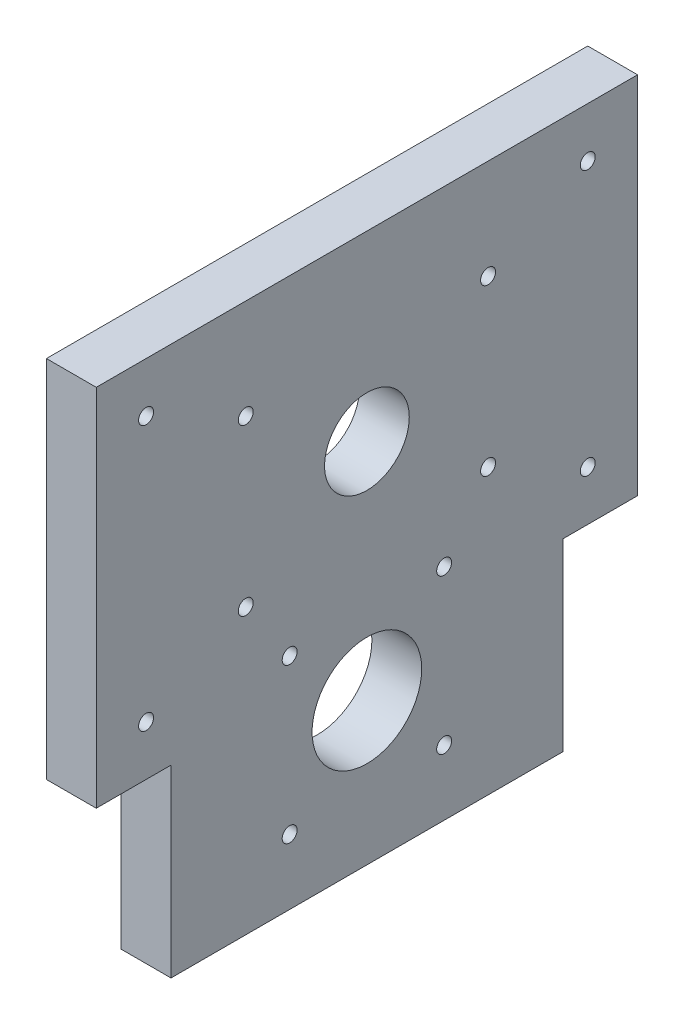
ISO-10303-21;
HEADER;
FILE_DESCRIPTION(('STEP AP214'),'2;1');
FILE_NAME('part.step','',(''),(''),'','','');
FILE_SCHEMA(('AUTOMOTIVE_DESIGN { 1 0 10303 214 1 1 1 1 }'));
ENDSEC;
DATA;
#1=APPLICATION_CONTEXT('core data for automotive mechanical design processes');
#2=APPLICATION_PROTOCOL_DEFINITION('international standard','automotive_design',2000,#1);
#3=PRODUCT_CONTEXT('',#1,'mechanical');
#4=PRODUCT('Part','Part','',(#3));
#5=PRODUCT_RELATED_PRODUCT_CATEGORY('part','',(#4));
#6=PRODUCT_DEFINITION_FORMATION('','',#4);
#7=PRODUCT_DEFINITION_CONTEXT('part definition',#1,'design');
#8=PRODUCT_DEFINITION('design','',#6,#7);
#9=PRODUCT_DEFINITION_SHAPE('','',#8);
#10=(LENGTH_UNIT() NAMED_UNIT(*) SI_UNIT(.MILLI.,.METRE.));
#11=(NAMED_UNIT(*) PLANE_ANGLE_UNIT() SI_UNIT($,.RADIAN.));
#12=(NAMED_UNIT(*) SI_UNIT($,.STERADIAN.) SOLID_ANGLE_UNIT());
#13=UNCERTAINTY_MEASURE_WITH_UNIT(LENGTH_MEASURE(1.E-05),#10,'distance_accuracy_value','');
#14=(GEOMETRIC_REPRESENTATION_CONTEXT(3) GLOBAL_UNCERTAINTY_ASSIGNED_CONTEXT((#13)) GLOBAL_UNIT_ASSIGNED_CONTEXT((#10,
#11,#12)) REPRESENTATION_CONTEXT('',''));
#15=CARTESIAN_POINT('',(0.,0.,0.));
#16=DIRECTION('',(0.,0.,1.));
#17=DIRECTION('',(1.,0.,0.));
#18=AXIS2_PLACEMENT_3D('',#15,#16,#17);
#19=CARTESIAN_POINT('',(10.,0.,0.));
#20=DIRECTION('',(1.,0.,0.));
#21=DIRECTION('',(0.,0.,-1.));
#22=AXIS2_PLACEMENT_3D('',#19,#20,#21);
#23=PLANE('',#22);
#24=CARTESIAN_POINT('',(10.,0.,-6.81500000000017));
#25=DIRECTION('',(1.,0.,0.));
#26=DIRECTION('',(0.,0.,-1.));
#27=AXIS2_PLACEMENT_3D('',#24,#25,#26);
#28=CIRCLE('',#27,8.5);
#29=CARTESIAN_POINT('',(10.,0.,-15.3150000000002));
#30=VERTEX_POINT('',#29);
#31=EDGE_CURVE('E251',#30,#30,#28,.T.);
#32=ORIENTED_EDGE('',*,*,#31,.F.);
#33=EDGE_LOOP('',(#32));
#34=FACE_BOUND('',#33,.T.);
#35=CARTESIAN_POINT('',(10.,-60.5,8.685));
#36=DIRECTION('',(1.,0.,0.));
#37=DIRECTION('',(0.,0.,-1.));
#38=AXIS2_PLACEMENT_3D('',#35,#36,#37);
#39=CIRCLE('',#38,1.5);
#40=CARTESIAN_POINT('',(10.,-60.5,7.18499999999999));
#41=VERTEX_POINT('',#40);
#42=EDGE_CURVE('E239',#41,#41,#39,.T.);
#43=ORIENTED_EDGE('',*,*,#42,.F.);
#44=EDGE_LOOP('',(#43));
#45=FACE_BOUND('',#44,.T.);
#46=CARTESIAN_POINT('',(10.,-29.5,8.685));
#47=DIRECTION('',(1.,0.,0.));
#48=DIRECTION('',(0.,0.,-1.));
#49=AXIS2_PLACEMENT_3D('',#46,#47,#48);
#50=CIRCLE('',#49,1.5);
#51=CARTESIAN_POINT('',(10.,-29.5,7.18499999999999));
#52=VERTEX_POINT('',#51);
#53=EDGE_CURVE('E227',#52,#52,#50,.T.);
#54=ORIENTED_EDGE('',*,*,#53,.F.);
#55=EDGE_LOOP('',(#54));
#56=FACE_BOUND('',#55,.T.);
#57=CARTESIAN_POINT('',(10.,-16.58,-31.1300000000003));
#58=DIRECTION('',(1.,0.,0.));
#59=DIRECTION('',(0.,0.,-1.));
#60=AXIS2_PLACEMENT_3D('',#57,#58,#59);
#61=CIRCLE('',#60,1.5);
#62=CARTESIAN_POINT('',(10.,-16.58,-32.6300000000003));
#63=VERTEX_POINT('',#62);
#64=EDGE_CURVE('E215',#63,#63,#61,.T.);
#65=ORIENTED_EDGE('',*,*,#64,.F.);
#66=EDGE_LOOP('',(#65));
#67=FACE_BOUND('',#66,.T.);
#68=CARTESIAN_POINT('',(10.,-26.58,37.4999999999994));
#69=DIRECTION('',(1.,0.,0.));
#70=DIRECTION('',(0.,0.,-1.));
#71=AXIS2_PLACEMENT_3D('',#68,#69,#70);
#72=CIRCLE('',#71,1.5);
#73=CARTESIAN_POINT('',(10.,-26.58,35.9999999999994));
#74=VERTEX_POINT('',#73);
#75=EDGE_CURVE('E203',#74,#74,#72,.T.);
#76=ORIENTED_EDGE('',*,*,#75,.F.);
#77=EDGE_LOOP('',(#76));
#78=FACE_BOUND('',#77,.T.);
#79=CARTESIAN_POINT('',(10.,16.58,-31.13));
#80=DIRECTION('',(1.,0.,0.));
#81=DIRECTION('',(0.,0.,-1.));
#82=AXIS2_PLACEMENT_3D('',#79,#80,#81);
#83=CIRCLE('',#82,1.5);
#84=CARTESIAN_POINT('',(10.,16.58,-32.63));
#85=VERTEX_POINT('',#84);
#86=EDGE_CURVE('E191',#85,#85,#83,.T.);
#87=ORIENTED_EDGE('',*,*,#86,.F.);
#88=EDGE_LOOP('',(#87));
#89=FACE_BOUND('',#88,.T.);
#90=CARTESIAN_POINT('',(10.,26.58,37.5));
#91=DIRECTION('',(1.,0.,0.));
#92=DIRECTION('',(0.,0.,-1.));
#93=AXIS2_PLACEMENT_3D('',#90,#91,#92);
#94=CIRCLE('',#93,1.5);
#95=CARTESIAN_POINT('',(10.,26.58,36.));
#96=VERTEX_POINT('',#95);
#97=EDGE_CURVE('E134',#96,#96,#94,.T.);
#98=ORIENTED_EDGE('',*,*,#97,.F.);
#99=EDGE_LOOP('',(#98));
#100=FACE_BOUND('',#99,.T.);
#101=DIRECTION('',(0.,0.,1.));
#102=VECTOR('',#101,1.);
#103=CARTESIAN_POINT('',(10.,36.58,-61.13));
#104=LINE('',#103,#102);
#105=CARTESIAN_POINT('',(10.,36.58,-61.13));
#106=VERTEX_POINT('',#105);
#107=CARTESIAN_POINT('',(10.,36.58,47.5));
#108=VERTEX_POINT('',#107);
#109=EDGE_CURVE('E94',#106,#108,#104,.T.);
#110=ORIENTED_EDGE('',*,*,#109,.T.);
#111=DIRECTION('',(0.,-1.,0.));
#112=VECTOR('',#111,1.);
#113=CARTESIAN_POINT('',(10.,36.58,47.5));
#114=LINE('',#113,#112);
#115=CARTESIAN_POINT('',(10.,-36.58,47.5));
#116=VERTEX_POINT('',#115);
#117=EDGE_CURVE('E179',#108,#116,#114,.T.);
#118=ORIENTED_EDGE('',*,*,#117,.T.);
#119=DIRECTION('',(0.,0.,-1.));
#120=VECTOR('',#119,1.);
#121=CARTESIAN_POINT('',(10.,-36.58,47.5));
#122=LINE('',#121,#120);
#123=CARTESIAN_POINT('',(10.,-36.58,32.5));
#124=VERTEX_POINT('',#123);
#125=EDGE_CURVE('E162',#116,#124,#122,.T.);
#126=ORIENTED_EDGE('',*,*,#125,.T.);
#127=DIRECTION('',(0.,-1.,0.));
#128=VECTOR('',#127,1.);
#129=CARTESIAN_POINT('',(10.,-36.58,32.5));
#130=LINE('',#129,#128);
#131=CARTESIAN_POINT('',(10.,-73.58,32.5));
#132=VERTEX_POINT('',#131);
#133=EDGE_CURVE('E175',#124,#132,#130,.T.);
#134=ORIENTED_EDGE('',*,*,#133,.T.);
#135=DIRECTION('',(0.,0.,-1.));
#136=VECTOR('',#135,1.);
#137=CARTESIAN_POINT('',(10.,-73.58,32.5));
#138=LINE('',#137,#136);
#139=CARTESIAN_POINT('',(10.,-73.58,-46.13));
#140=VERTEX_POINT('',#139);
#141=EDGE_CURVE('E114',#132,#140,#138,.T.);
#142=ORIENTED_EDGE('',*,*,#141,.T.);
#143=DIRECTION('',(0.,1.,0.));
#144=VECTOR('',#143,1.);
#145=CARTESIAN_POINT('',(10.,-73.58,-46.13));
#146=LINE('',#145,#144);
#147=CARTESIAN_POINT('',(10.,-36.58,-46.13));
#148=VERTEX_POINT('',#147);
#149=EDGE_CURVE('E108',#140,#148,#146,.T.);
#150=ORIENTED_EDGE('',*,*,#149,.T.);
#151=DIRECTION('',(0.,0.,-1.));
#152=VECTOR('',#151,1.);
#153=CARTESIAN_POINT('',(10.,-36.58,-46.13));
#154=LINE('',#153,#152);
#155=CARTESIAN_POINT('',(10.,-36.58,-61.13));
#156=VERTEX_POINT('',#155);
#157=EDGE_CURVE('E112',#148,#156,#154,.T.);
#158=ORIENTED_EDGE('',*,*,#157,.T.);
#159=DIRECTION('',(0.,1.,0.));
#160=VECTOR('',#159,1.);
#161=CARTESIAN_POINT('',(10.,-36.58,-61.13));
#162=LINE('',#161,#160);
#163=EDGE_CURVE('E52',#156,#106,#162,.T.);
#164=ORIENTED_EDGE('',*,*,#163,.T.);
#165=EDGE_LOOP('',(#110,#118,#126,#134,#142,#150,#158,#164));
#166=FACE_BOUND('',#165,.T.);
#167=CARTESIAN_POINT('',(10.,16.58,17.5));
#168=DIRECTION('',(1.,0.,0.));
#169=DIRECTION('',(0.,0.,-1.));
#170=AXIS2_PLACEMENT_3D('',#167,#168,#169);
#171=CIRCLE('',#170,1.5);
#172=CARTESIAN_POINT('',(10.,16.58,16.));
#173=VERTEX_POINT('',#172);
#174=EDGE_CURVE('E185',#173,#173,#171,.T.);
#175=ORIENTED_EDGE('',*,*,#174,.F.);
#176=EDGE_LOOP('',(#175));
#177=FACE_BOUND('',#176,.T.);
#178=CARTESIAN_POINT('',(10.,26.58,-51.13));
#179=DIRECTION('',(1.,0.,0.));
#180=DIRECTION('',(0.,0.,-1.));
#181=AXIS2_PLACEMENT_3D('',#178,#179,#180);
#182=CIRCLE('',#181,1.5);
#183=CARTESIAN_POINT('',(10.,26.58,-52.63));
#184=VERTEX_POINT('',#183);
#185=EDGE_CURVE('E197',#184,#184,#182,.T.);
#186=ORIENTED_EDGE('',*,*,#185,.F.);
#187=EDGE_LOOP('',(#186));
#188=FACE_BOUND('',#187,.T.);
#189=CARTESIAN_POINT('',(10.,-16.58,17.4999999999997));
#190=DIRECTION('',(1.,0.,0.));
#191=DIRECTION('',(0.,0.,-1.));
#192=AXIS2_PLACEMENT_3D('',#189,#190,#191);
#193=CIRCLE('',#192,1.5);
#194=CARTESIAN_POINT('',(10.,-16.58,15.9999999999997));
#195=VERTEX_POINT('',#194);
#196=EDGE_CURVE('E209',#195,#195,#193,.T.);
#197=ORIENTED_EDGE('',*,*,#196,.F.);
#198=EDGE_LOOP('',(#197));
#199=FACE_BOUND('',#198,.T.);
#200=CARTESIAN_POINT('',(10.,-26.58,-51.1300000000006));
#201=DIRECTION('',(1.,0.,0.));
#202=DIRECTION('',(0.,0.,-1.));
#203=AXIS2_PLACEMENT_3D('',#200,#201,#202);
#204=CIRCLE('',#203,1.5);
#205=CARTESIAN_POINT('',(10.,-26.58,-52.6300000000005));
#206=VERTEX_POINT('',#205);
#207=EDGE_CURVE('E221',#206,#206,#204,.T.);
#208=ORIENTED_EDGE('',*,*,#207,.F.);
#209=EDGE_LOOP('',(#208));
#210=FACE_BOUND('',#209,.T.);
#211=CARTESIAN_POINT('',(10.,-29.5,-22.315));
#212=DIRECTION('',(1.,0.,0.));
#213=DIRECTION('',(0.,0.,-1.));
#214=AXIS2_PLACEMENT_3D('',#211,#212,#213);
#215=CIRCLE('',#214,1.5);
#216=CARTESIAN_POINT('',(10.,-29.5,-23.815));
#217=VERTEX_POINT('',#216);
#218=EDGE_CURVE('E233',#217,#217,#215,.T.);
#219=ORIENTED_EDGE('',*,*,#218,.F.);
#220=EDGE_LOOP('',(#219));
#221=FACE_BOUND('',#220,.T.);
#222=CARTESIAN_POINT('',(10.,-60.5,-22.315));
#223=DIRECTION('',(1.,0.,0.));
#224=DIRECTION('',(0.,0.,-1.));
#225=AXIS2_PLACEMENT_3D('',#222,#223,#224);
#226=CIRCLE('',#225,1.5);
#227=CARTESIAN_POINT('',(10.,-60.5,-23.815));
#228=VERTEX_POINT('',#227);
#229=EDGE_CURVE('E245',#228,#228,#226,.T.);
#230=ORIENTED_EDGE('',*,*,#229,.F.);
#231=EDGE_LOOP('',(#230));
#232=FACE_BOUND('',#231,.T.);
#233=CARTESIAN_POINT('',(10.,-45.,-6.81500000000001));
#234=DIRECTION('',(1.,0.,0.));
#235=DIRECTION('',(0.,0.,-1.));
#236=AXIS2_PLACEMENT_3D('',#233,#234,#235);
#237=CIRCLE('',#236,11.);
#238=CARTESIAN_POINT('',(10.,-45.,-17.815));
#239=VERTEX_POINT('',#238);
#240=EDGE_CURVE('E257',#239,#239,#237,.T.);
#241=ORIENTED_EDGE('',*,*,#240,.F.);
#242=EDGE_LOOP('',(#241));
#243=FACE_BOUND('',#242,.T.);
#244=ADVANCED_FACE('F35',(#34,#45,#56,#67,#78,#89,#100,#166,#177,#188,#199,#210,#221,#232,#243),
#23,.T.);
#245=CARTESIAN_POINT('',(0.,0.,0.));
#246=DIRECTION('',(1.,0.,0.));
#247=DIRECTION('',(0.,0.,-1.));
#248=AXIS2_PLACEMENT_3D('',#245,#246,#247);
#249=PLANE('',#248);
#250=DIRECTION('',(0.,0.,1.));
#251=VECTOR('',#250,1.);
#252=CARTESIAN_POINT('',(0.,36.58,27.5));
#253=LINE('',#252,#251);
#254=CARTESIAN_POINT('',(0.,36.58,-61.13));
#255=VERTEX_POINT('',#254);
#256=CARTESIAN_POINT('',(0.,36.58,47.5));
#257=VERTEX_POINT('',#256);
#258=EDGE_CURVE('E88',#255,#257,#253,.T.);
#259=ORIENTED_EDGE('',*,*,#258,.F.);
#260=DIRECTION('',(0.,1.,0.));
#261=VECTOR('',#260,1.);
#262=CARTESIAN_POINT('',(0.,-36.58,-61.13));
#263=LINE('',#262,#261);
#264=CARTESIAN_POINT('',(0.,-36.58,-61.13));
#265=VERTEX_POINT('',#264);
#266=EDGE_CURVE('E144',#265,#255,#263,.T.);
#267=ORIENTED_EDGE('',*,*,#266,.F.);
#268=DIRECTION('',(0.,0.,-1.));
#269=VECTOR('',#268,1.);
#270=CARTESIAN_POINT('',(0.,-36.58,-46.13));
#271=LINE('',#270,#269);
#272=CARTESIAN_POINT('',(0.,-36.58,-46.13));
#273=VERTEX_POINT('',#272);
#274=EDGE_CURVE('E81',#273,#265,#271,.T.);
#275=ORIENTED_EDGE('',*,*,#274,.F.);
#276=DIRECTION('',(0.,1.,0.));
#277=VECTOR('',#276,1.);
#278=CARTESIAN_POINT('',(0.,-73.58,-46.13));
#279=LINE('',#278,#277);
#280=CARTESIAN_POINT('',(0.,-73.58,-46.13));
#281=VERTEX_POINT('',#280);
#282=EDGE_CURVE('E122',#281,#273,#279,.T.);
#283=ORIENTED_EDGE('',*,*,#282,.F.);
#284=DIRECTION('',(0.,0.,-1.));
#285=VECTOR('',#284,1.);
#286=CARTESIAN_POINT('',(0.,-73.58,32.5));
#287=LINE('',#286,#285);
#288=CARTESIAN_POINT('',(0.,-73.58,32.5));
#289=VERTEX_POINT('',#288);
#290=EDGE_CURVE('E140',#289,#281,#287,.T.);
#291=ORIENTED_EDGE('',*,*,#290,.F.);
#292=DIRECTION('',(0.,-1.,0.));
#293=VECTOR('',#292,1.);
#294=CARTESIAN_POINT('',(0.,-36.58,32.5));
#295=LINE('',#294,#293);
#296=CARTESIAN_POINT('',(0.,-36.58,32.5));
#297=VERTEX_POINT('',#296);
#298=EDGE_CURVE('E138',#297,#289,#295,.T.);
#299=ORIENTED_EDGE('',*,*,#298,.F.);
#300=DIRECTION('',(0.,0.,-1.));
#301=VECTOR('',#300,1.);
#302=CARTESIAN_POINT('',(0.,-36.58,47.5));
#303=LINE('',#302,#301);
#304=CARTESIAN_POINT('',(0.,-36.58,47.5));
#305=VERTEX_POINT('',#304);
#306=EDGE_CURVE('E136',#305,#297,#303,.T.);
#307=ORIENTED_EDGE('',*,*,#306,.F.);
#308=DIRECTION('',(0.,-1.,0.));
#309=VECTOR('',#308,1.);
#310=CARTESIAN_POINT('',(0.,36.58,47.5));
#311=LINE('',#310,#309);
#312=EDGE_CURVE('E133',#257,#305,#311,.T.);
#313=ORIENTED_EDGE('',*,*,#312,.F.);
#314=EDGE_LOOP('',(#259,#267,#275,#283,#291,#299,#307,#313));
#315=FACE_BOUND('',#314,.T.);
#316=CARTESIAN_POINT('',(0.,26.58,37.5));
#317=DIRECTION('',(1.,0.,0.));
#318=DIRECTION('',(0.,0.,-1.));
#319=AXIS2_PLACEMENT_3D('',#316,#317,#318);
#320=CIRCLE('',#319,1.5);
#321=CARTESIAN_POINT('',(0.,26.58,36.));
#322=VERTEX_POINT('',#321);
#323=EDGE_CURVE('E182',#322,#322,#320,.T.);
#324=ORIENTED_EDGE('',*,*,#323,.T.);
#325=EDGE_LOOP('',(#324));
#326=FACE_BOUND('',#325,.T.);
#327=CARTESIAN_POINT('',(0.,16.58,17.5));
#328=DIRECTION('',(1.,0.,0.));
#329=DIRECTION('',(0.,0.,-1.));
#330=AXIS2_PLACEMENT_3D('',#327,#328,#329);
#331=CIRCLE('',#330,1.5);
#332=CARTESIAN_POINT('',(0.,16.58,16.));
#333=VERTEX_POINT('',#332);
#334=EDGE_CURVE('E188',#333,#333,#331,.T.);
#335=ORIENTED_EDGE('',*,*,#334,.T.);
#336=EDGE_LOOP('',(#335));
#337=FACE_BOUND('',#336,.T.);
#338=CARTESIAN_POINT('',(0.,16.58,-31.13));
#339=DIRECTION('',(1.,0.,0.));
#340=DIRECTION('',(0.,0.,-1.));
#341=AXIS2_PLACEMENT_3D('',#338,#339,#340);
#342=CIRCLE('',#341,1.5);
#343=CARTESIAN_POINT('',(0.,16.58,-32.63));
#344=VERTEX_POINT('',#343);
#345=EDGE_CURVE('E194',#344,#344,#342,.T.);
#346=ORIENTED_EDGE('',*,*,#345,.T.);
#347=EDGE_LOOP('',(#346));
#348=FACE_BOUND('',#347,.T.);
#349=CARTESIAN_POINT('',(0.,26.58,-51.13));
#350=DIRECTION('',(1.,0.,0.));
#351=DIRECTION('',(0.,0.,-1.));
#352=AXIS2_PLACEMENT_3D('',#349,#350,#351);
#353=CIRCLE('',#352,1.5);
#354=CARTESIAN_POINT('',(0.,26.58,-52.63));
#355=VERTEX_POINT('',#354);
#356=EDGE_CURVE('E200',#355,#355,#353,.T.);
#357=ORIENTED_EDGE('',*,*,#356,.T.);
#358=EDGE_LOOP('',(#357));
#359=FACE_BOUND('',#358,.T.);
#360=CARTESIAN_POINT('',(0.,-26.58,37.4999999999994));
#361=DIRECTION('',(1.,0.,0.));
#362=DIRECTION('',(0.,0.,-1.));
#363=AXIS2_PLACEMENT_3D('',#360,#361,#362);
#364=CIRCLE('',#363,1.5);
#365=CARTESIAN_POINT('',(0.,-26.58,35.9999999999994));
#366=VERTEX_POINT('',#365);
#367=EDGE_CURVE('E206',#366,#366,#364,.T.);
#368=ORIENTED_EDGE('',*,*,#367,.T.);
#369=EDGE_LOOP('',(#368));
#370=FACE_BOUND('',#369,.T.);
#371=CARTESIAN_POINT('',(0.,-16.58,17.4999999999997));
#372=DIRECTION('',(1.,0.,0.));
#373=DIRECTION('',(0.,0.,-1.));
#374=AXIS2_PLACEMENT_3D('',#371,#372,#373);
#375=CIRCLE('',#374,1.5);
#376=CARTESIAN_POINT('',(0.,-16.58,15.9999999999997));
#377=VERTEX_POINT('',#376);
#378=EDGE_CURVE('E212',#377,#377,#375,.T.);
#379=ORIENTED_EDGE('',*,*,#378,.T.);
#380=EDGE_LOOP('',(#379));
#381=FACE_BOUND('',#380,.T.);
#382=CARTESIAN_POINT('',(0.,-16.58,-31.1300000000003));
#383=DIRECTION('',(1.,0.,0.));
#384=DIRECTION('',(0.,0.,-1.));
#385=AXIS2_PLACEMENT_3D('',#382,#383,#384);
#386=CIRCLE('',#385,1.5);
#387=CARTESIAN_POINT('',(0.,-16.58,-32.6300000000003));
#388=VERTEX_POINT('',#387);
#389=EDGE_CURVE('E218',#388,#388,#386,.T.);
#390=ORIENTED_EDGE('',*,*,#389,.T.);
#391=EDGE_LOOP('',(#390));
#392=FACE_BOUND('',#391,.T.);
#393=CARTESIAN_POINT('',(0.,-26.58,-51.1300000000006));
#394=DIRECTION('',(1.,0.,0.));
#395=DIRECTION('',(0.,0.,-1.));
#396=AXIS2_PLACEMENT_3D('',#393,#394,#395);
#397=CIRCLE('',#396,1.5);
#398=CARTESIAN_POINT('',(0.,-26.58,-52.6300000000005));
#399=VERTEX_POINT('',#398);
#400=EDGE_CURVE('E224',#399,#399,#397,.T.);
#401=ORIENTED_EDGE('',*,*,#400,.T.);
#402=EDGE_LOOP('',(#401));
#403=FACE_BOUND('',#402,.T.);
#404=CARTESIAN_POINT('',(0.,-29.5,8.685));
#405=DIRECTION('',(1.,0.,0.));
#406=DIRECTION('',(0.,0.,-1.));
#407=AXIS2_PLACEMENT_3D('',#404,#405,#406);
#408=CIRCLE('',#407,1.5);
#409=CARTESIAN_POINT('',(0.,-29.5,7.18499999999999));
#410=VERTEX_POINT('',#409);
#411=EDGE_CURVE('E230',#410,#410,#408,.T.);
#412=ORIENTED_EDGE('',*,*,#411,.T.);
#413=EDGE_LOOP('',(#412));
#414=FACE_BOUND('',#413,.T.);
#415=CARTESIAN_POINT('',(0.,-29.5,-22.315));
#416=DIRECTION('',(1.,0.,0.));
#417=DIRECTION('',(0.,0.,-1.));
#418=AXIS2_PLACEMENT_3D('',#415,#416,#417);
#419=CIRCLE('',#418,1.5);
#420=CARTESIAN_POINT('',(0.,-29.5,-23.815));
#421=VERTEX_POINT('',#420);
#422=EDGE_CURVE('E236',#421,#421,#419,.T.);
#423=ORIENTED_EDGE('',*,*,#422,.T.);
#424=EDGE_LOOP('',(#423));
#425=FACE_BOUND('',#424,.T.);
#426=CARTESIAN_POINT('',(0.,-60.5,8.685));
#427=DIRECTION('',(1.,0.,0.));
#428=DIRECTION('',(0.,0.,-1.));
#429=AXIS2_PLACEMENT_3D('',#426,#427,#428);
#430=CIRCLE('',#429,1.5);
#431=CARTESIAN_POINT('',(0.,-60.5,7.18499999999999));
#432=VERTEX_POINT('',#431);
#433=EDGE_CURVE('E242',#432,#432,#430,.T.);
#434=ORIENTED_EDGE('',*,*,#433,.T.);
#435=EDGE_LOOP('',(#434));
#436=FACE_BOUND('',#435,.T.);
#437=CARTESIAN_POINT('',(0.,-60.5,-22.315));
#438=DIRECTION('',(1.,0.,0.));
#439=DIRECTION('',(0.,0.,-1.));
#440=AXIS2_PLACEMENT_3D('',#437,#438,#439);
#441=CIRCLE('',#440,1.5);
#442=CARTESIAN_POINT('',(0.,-60.5,-23.815));
#443=VERTEX_POINT('',#442);
#444=EDGE_CURVE('E248',#443,#443,#441,.T.);
#445=ORIENTED_EDGE('',*,*,#444,.T.);
#446=EDGE_LOOP('',(#445));
#447=FACE_BOUND('',#446,.T.);
#448=CARTESIAN_POINT('',(0.,0.,-6.81500000000017));
#449=DIRECTION('',(1.,0.,0.));
#450=DIRECTION('',(0.,0.,-1.));
#451=AXIS2_PLACEMENT_3D('',#448,#449,#450);
#452=CIRCLE('',#451,8.5);
#453=CARTESIAN_POINT('',(0.,0.,-15.3150000000002));
#454=VERTEX_POINT('',#453);
#455=EDGE_CURVE('E254',#454,#454,#452,.T.);
#456=ORIENTED_EDGE('',*,*,#455,.T.);
#457=EDGE_LOOP('',(#456));
#458=FACE_BOUND('',#457,.T.);
#459=CARTESIAN_POINT('',(0.,-45.,-6.81500000000001));
#460=DIRECTION('',(1.,0.,0.));
#461=DIRECTION('',(0.,0.,-1.));
#462=AXIS2_PLACEMENT_3D('',#459,#460,#461);
#463=CIRCLE('',#462,11.);
#464=CARTESIAN_POINT('',(0.,-45.,-17.815));
#465=VERTEX_POINT('',#464);
#466=EDGE_CURVE('E260',#465,#465,#463,.T.);
#467=ORIENTED_EDGE('',*,*,#466,.T.);
#468=EDGE_LOOP('',(#467));
#469=FACE_BOUND('',#468,.T.);
#470=ADVANCED_FACE('F166',(#315,#326,#337,#348,#359,#370,#381,#392,#403,#414,#425,#436,#447,
#458,#469),#249,.F.);
#471=CARTESIAN_POINT('',(10.,36.58,27.5));
#472=DIRECTION('',(0.,-1.,0.));
#473=DIRECTION('',(0.,0.,-1.));
#474=AXIS2_PLACEMENT_3D('',#471,#472,#473);
#475=PLANE('',#474);
#476=ORIENTED_EDGE('',*,*,#258,.T.);
#477=DIRECTION('',(-1.,0.,0.));
#478=VECTOR('',#477,1.);
#479=CARTESIAN_POINT('',(10.,36.58,47.5));
#480=LINE('',#479,#478);
#481=EDGE_CURVE('E11',#108,#257,#480,.T.);
#482=ORIENTED_EDGE('',*,*,#481,.F.);
#483=ORIENTED_EDGE('',*,*,#109,.F.);
#484=DIRECTION('',(-1.,0.,0.));
#485=VECTOR('',#484,1.);
#486=CARTESIAN_POINT('',(10.,36.58,-61.13));
#487=LINE('',#486,#485);
#488=EDGE_CURVE('E128',#106,#255,#487,.T.);
#489=ORIENTED_EDGE('',*,*,#488,.T.);
#490=EDGE_LOOP('',(#476,#482,#483,#489));
#491=FACE_BOUND('',#490,.T.);
#492=ADVANCED_FACE('F37',(#491),#475,.F.);
#493=CARTESIAN_POINT('',(10.,36.58,47.5));
#494=DIRECTION('',(0.,0.,-1.));
#495=DIRECTION('',(0.,1.,0.));
#496=AXIS2_PLACEMENT_3D('',#493,#494,#495);
#497=PLANE('',#496);
#498=ORIENTED_EDGE('',*,*,#312,.T.);
#499=DIRECTION('',(-1.,0.,0.));
#500=VECTOR('',#499,1.);
#501=CARTESIAN_POINT('',(10.,-36.58,47.5));
#502=LINE('',#501,#500);
#503=EDGE_CURVE('E44',#116,#305,#502,.T.);
#504=ORIENTED_EDGE('',*,*,#503,.F.);
#505=ORIENTED_EDGE('',*,*,#117,.F.);
#506=ORIENTED_EDGE('',*,*,#481,.T.);
#507=EDGE_LOOP('',(#498,#504,#505,#506));
#508=FACE_BOUND('',#507,.T.);
#509=ADVANCED_FACE('F295',(#508),#497,.F.);
#510=CARTESIAN_POINT('',(10.,-36.58,47.5));
#511=DIRECTION('',(0.,1.,0.));
#512=DIRECTION('',(0.,0.,1.));
#513=AXIS2_PLACEMENT_3D('',#510,#511,#512);
#514=PLANE('',#513);
#515=ORIENTED_EDGE('',*,*,#306,.T.);
#516=DIRECTION('',(-1.,0.,0.));
#517=VECTOR('',#516,1.);
#518=CARTESIAN_POINT('',(10.,-36.58,32.5));
#519=LINE('',#518,#517);
#520=EDGE_CURVE('E153',#124,#297,#519,.T.);
#521=ORIENTED_EDGE('',*,*,#520,.F.);
#522=ORIENTED_EDGE('',*,*,#125,.F.);
#523=ORIENTED_EDGE('',*,*,#503,.T.);
#524=EDGE_LOOP('',(#515,#521,#522,#523));
#525=FACE_BOUND('',#524,.T.);
#526=ADVANCED_FACE('F160',(#525),#514,.F.);
#527=CARTESIAN_POINT('',(10.,-36.58,32.5));
#528=DIRECTION('',(0.,0.,-1.));
#529=DIRECTION('',(0.,1.,0.));
#530=AXIS2_PLACEMENT_3D('',#527,#528,#529);
#531=PLANE('',#530);
#532=ORIENTED_EDGE('',*,*,#298,.T.);
#533=DIRECTION('',(-1.,0.,0.));
#534=VECTOR('',#533,1.);
#535=CARTESIAN_POINT('',(10.,-73.58,32.5));
#536=LINE('',#535,#534);
#537=EDGE_CURVE('E150',#132,#289,#536,.T.);
#538=ORIENTED_EDGE('',*,*,#537,.F.);
#539=ORIENTED_EDGE('',*,*,#133,.F.);
#540=ORIENTED_EDGE('',*,*,#520,.T.);
#541=EDGE_LOOP('',(#532,#538,#539,#540));
#542=FACE_BOUND('',#541,.T.);
#543=ADVANCED_FACE('F171',(#542),#531,.F.);
#544=CARTESIAN_POINT('',(10.,-73.58,32.5));
#545=DIRECTION('',(0.,1.,0.));
#546=DIRECTION('',(0.,0.,1.));
#547=AXIS2_PLACEMENT_3D('',#544,#545,#546);
#548=PLANE('',#547);
#549=ORIENTED_EDGE('',*,*,#290,.T.);
#550=DIRECTION('',(-1.,0.,0.));
#551=VECTOR('',#550,1.);
#552=CARTESIAN_POINT('',(10.,-73.58,-46.13));
#553=LINE('',#552,#551);
#554=EDGE_CURVE('E123',#140,#281,#553,.T.);
#555=ORIENTED_EDGE('',*,*,#554,.F.);
#556=ORIENTED_EDGE('',*,*,#141,.F.);
#557=ORIENTED_EDGE('',*,*,#537,.T.);
#558=EDGE_LOOP('',(#549,#555,#556,#557));
#559=FACE_BOUND('',#558,.T.);
#560=ADVANCED_FACE('F174',(#559),#548,.F.);
#561=CARTESIAN_POINT('',(10.,-73.58,-46.13));
#562=DIRECTION('',(0.,0.,1.));
#563=DIRECTION('',(0.,-1.,0.));
#564=AXIS2_PLACEMENT_3D('',#561,#562,#563);
#565=PLANE('',#564);
#566=ORIENTED_EDGE('',*,*,#282,.T.);
#567=DIRECTION('',(-1.,0.,0.));
#568=VECTOR('',#567,1.);
#569=CARTESIAN_POINT('',(10.,-36.58,-46.13));
#570=LINE('',#569,#568);
#571=EDGE_CURVE('E119',#148,#273,#570,.T.);
#572=ORIENTED_EDGE('',*,*,#571,.F.);
#573=ORIENTED_EDGE('',*,*,#149,.F.);
#574=ORIENTED_EDGE('',*,*,#554,.T.);
#575=EDGE_LOOP('',(#566,#572,#573,#574));
#576=FACE_BOUND('',#575,.T.);
#577=ADVANCED_FACE('F120',(#576),#565,.F.);
#578=CARTESIAN_POINT('',(10.,-36.58,-46.13));
#579=DIRECTION('',(0.,1.,0.));
#580=DIRECTION('',(0.,0.,1.));
#581=AXIS2_PLACEMENT_3D('',#578,#579,#580);
#582=PLANE('',#581);
#583=ORIENTED_EDGE('',*,*,#274,.T.);
#584=DIRECTION('',(-1.,0.,0.));
#585=VECTOR('',#584,1.);
#586=CARTESIAN_POINT('',(10.,-36.58,-61.13));
#587=LINE('',#586,#585);
#588=EDGE_CURVE('E124',#156,#265,#587,.T.);
#589=ORIENTED_EDGE('',*,*,#588,.F.);
#590=ORIENTED_EDGE('',*,*,#157,.F.);
#591=ORIENTED_EDGE('',*,*,#571,.T.);
#592=EDGE_LOOP('',(#583,#589,#590,#591));
#593=FACE_BOUND('',#592,.T.);
#594=ADVANCED_FACE('F126',(#593),#582,.F.);
#595=CARTESIAN_POINT('',(10.,-36.58,-61.13));
#596=DIRECTION('',(0.,0.,1.));
#597=DIRECTION('',(1.,0.,0.));
#598=AXIS2_PLACEMENT_3D('',#595,#596,#597);
#599=PLANE('',#598);
#600=ORIENTED_EDGE('',*,*,#266,.T.);
#601=ORIENTED_EDGE('',*,*,#488,.F.);
#602=ORIENTED_EDGE('',*,*,#163,.F.);
#603=ORIENTED_EDGE('',*,*,#588,.T.);
#604=EDGE_LOOP('',(#600,#601,#602,#603));
#605=FACE_BOUND('',#604,.T.);
#606=ADVANCED_FACE('F282',(#605),#599,.F.);
#607=CARTESIAN_POINT('',(10.,26.58,37.5));
#608=DIRECTION('',(-1.,0.,0.));
#609=DIRECTION('',(0.,0.,1.));
#610=AXIS2_PLACEMENT_3D('',#607,#608,#609);
#611=CYLINDRICAL_SURFACE('',#610,1.5);
#612=ORIENTED_EDGE('',*,*,#97,.T.);
#613=EDGE_LOOP('',(#612));
#614=FACE_BOUND('',#613,.T.);
#615=ORIENTED_EDGE('',*,*,#323,.F.);
#616=EDGE_LOOP('',(#615));
#617=FACE_BOUND('',#616,.T.);
#618=ADVANCED_FACE('F279',(#614,#617),#611,.F.);
#619=CARTESIAN_POINT('',(10.,16.58,17.5));
#620=DIRECTION('',(-1.,0.,0.));
#621=DIRECTION('',(0.,0.,1.));
#622=AXIS2_PLACEMENT_3D('',#619,#620,#621);
#623=CYLINDRICAL_SURFACE('',#622,1.5);
#624=ORIENTED_EDGE('',*,*,#174,.T.);
#625=EDGE_LOOP('',(#624));
#626=FACE_BOUND('',#625,.T.);
#627=ORIENTED_EDGE('',*,*,#334,.F.);
#628=EDGE_LOOP('',(#627));
#629=FACE_BOUND('',#628,.T.);
#630=ADVANCED_FACE('F360',(#626,#629),#623,.F.);
#631=CARTESIAN_POINT('',(10.,16.58,-31.13));
#632=DIRECTION('',(-1.,0.,0.));
#633=DIRECTION('',(0.,0.,1.));
#634=AXIS2_PLACEMENT_3D('',#631,#632,#633);
#635=CYLINDRICAL_SURFACE('',#634,1.5);
#636=ORIENTED_EDGE('',*,*,#86,.T.);
#637=EDGE_LOOP('',(#636));
#638=FACE_BOUND('',#637,.T.);
#639=ORIENTED_EDGE('',*,*,#345,.F.);
#640=EDGE_LOOP('',(#639));
#641=FACE_BOUND('',#640,.T.);
#642=ADVANCED_FACE('F368',(#638,#641),#635,.F.);
#643=CARTESIAN_POINT('',(10.,26.58,-51.13));
#644=DIRECTION('',(-1.,0.,0.));
#645=DIRECTION('',(0.,0.,1.));
#646=AXIS2_PLACEMENT_3D('',#643,#644,#645);
#647=CYLINDRICAL_SURFACE('',#646,1.5);
#648=ORIENTED_EDGE('',*,*,#185,.T.);
#649=EDGE_LOOP('',(#648));
#650=FACE_BOUND('',#649,.T.);
#651=ORIENTED_EDGE('',*,*,#356,.F.);
#652=EDGE_LOOP('',(#651));
#653=FACE_BOUND('',#652,.T.);
#654=ADVANCED_FACE('F376',(#650,#653),#647,.F.);
#655=CARTESIAN_POINT('',(10.,-26.58,37.4999999999994));
#656=DIRECTION('',(-1.,0.,0.));
#657=DIRECTION('',(0.,0.,1.));
#658=AXIS2_PLACEMENT_3D('',#655,#656,#657);
#659=CYLINDRICAL_SURFACE('',#658,1.5);
#660=ORIENTED_EDGE('',*,*,#75,.T.);
#661=EDGE_LOOP('',(#660));
#662=FACE_BOUND('',#661,.T.);
#663=ORIENTED_EDGE('',*,*,#367,.F.);
#664=EDGE_LOOP('',(#663));
#665=FACE_BOUND('',#664,.T.);
#666=ADVANCED_FACE('F385',(#662,#665),#659,.F.);
#667=CARTESIAN_POINT('',(10.,-16.58,17.4999999999997));
#668=DIRECTION('',(-1.,0.,0.));
#669=DIRECTION('',(0.,0.,1.));
#670=AXIS2_PLACEMENT_3D('',#667,#668,#669);
#671=CYLINDRICAL_SURFACE('',#670,1.5);
#672=ORIENTED_EDGE('',*,*,#196,.T.);
#673=EDGE_LOOP('',(#672));
#674=FACE_BOUND('',#673,.T.);
#675=ORIENTED_EDGE('',*,*,#378,.F.);
#676=EDGE_LOOP('',(#675));
#677=FACE_BOUND('',#676,.T.);
#678=ADVANCED_FACE('F394',(#674,#677),#671,.F.);
#679=CARTESIAN_POINT('',(10.,-16.58,-31.1300000000003));
#680=DIRECTION('',(-1.,0.,0.));
#681=DIRECTION('',(0.,0.,1.));
#682=AXIS2_PLACEMENT_3D('',#679,#680,#681);
#683=CYLINDRICAL_SURFACE('',#682,1.5);
#684=ORIENTED_EDGE('',*,*,#64,.T.);
#685=EDGE_LOOP('',(#684));
#686=FACE_BOUND('',#685,.T.);
#687=ORIENTED_EDGE('',*,*,#389,.F.);
#688=EDGE_LOOP('',(#687));
#689=FACE_BOUND('',#688,.T.);
#690=ADVANCED_FACE('F403',(#686,#689),#683,.F.);
#691=CARTESIAN_POINT('',(10.,-26.58,-51.1300000000006));
#692=DIRECTION('',(-1.,0.,0.));
#693=DIRECTION('',(0.,0.,1.));
#694=AXIS2_PLACEMENT_3D('',#691,#692,#693);
#695=CYLINDRICAL_SURFACE('',#694,1.5);
#696=ORIENTED_EDGE('',*,*,#207,.T.);
#697=EDGE_LOOP('',(#696));
#698=FACE_BOUND('',#697,.T.);
#699=ORIENTED_EDGE('',*,*,#400,.F.);
#700=EDGE_LOOP('',(#699));
#701=FACE_BOUND('',#700,.T.);
#702=ADVANCED_FACE('F412',(#698,#701),#695,.F.);
#703=CARTESIAN_POINT('',(10.,-29.5,8.685));
#704=DIRECTION('',(-1.,0.,0.));
#705=DIRECTION('',(0.,0.,1.));
#706=AXIS2_PLACEMENT_3D('',#703,#704,#705);
#707=CYLINDRICAL_SURFACE('',#706,1.5);
#708=ORIENTED_EDGE('',*,*,#53,.T.);
#709=EDGE_LOOP('',(#708));
#710=FACE_BOUND('',#709,.T.);
#711=ORIENTED_EDGE('',*,*,#411,.F.);
#712=EDGE_LOOP('',(#711));
#713=FACE_BOUND('',#712,.T.);
#714=ADVANCED_FACE('F421',(#710,#713),#707,.F.);
#715=CARTESIAN_POINT('',(10.,-29.5,-22.315));
#716=DIRECTION('',(-1.,0.,0.));
#717=DIRECTION('',(0.,0.,1.));
#718=AXIS2_PLACEMENT_3D('',#715,#716,#717);
#719=CYLINDRICAL_SURFACE('',#718,1.5);
#720=ORIENTED_EDGE('',*,*,#218,.T.);
#721=EDGE_LOOP('',(#720));
#722=FACE_BOUND('',#721,.T.);
#723=ORIENTED_EDGE('',*,*,#422,.F.);
#724=EDGE_LOOP('',(#723));
#725=FACE_BOUND('',#724,.T.);
#726=ADVANCED_FACE('F430',(#722,#725),#719,.F.);
#727=CARTESIAN_POINT('',(10.,-60.5,8.685));
#728=DIRECTION('',(-1.,0.,0.));
#729=DIRECTION('',(0.,0.,1.));
#730=AXIS2_PLACEMENT_3D('',#727,#728,#729);
#731=CYLINDRICAL_SURFACE('',#730,1.5);
#732=ORIENTED_EDGE('',*,*,#42,.T.);
#733=EDGE_LOOP('',(#732));
#734=FACE_BOUND('',#733,.T.);
#735=ORIENTED_EDGE('',*,*,#433,.F.);
#736=EDGE_LOOP('',(#735));
#737=FACE_BOUND('',#736,.T.);
#738=ADVANCED_FACE('F439',(#734,#737),#731,.F.);
#739=CARTESIAN_POINT('',(10.,-60.5,-22.315));
#740=DIRECTION('',(-1.,0.,0.));
#741=DIRECTION('',(0.,0.,1.));
#742=AXIS2_PLACEMENT_3D('',#739,#740,#741);
#743=CYLINDRICAL_SURFACE('',#742,1.5);
#744=ORIENTED_EDGE('',*,*,#229,.T.);
#745=EDGE_LOOP('',(#744));
#746=FACE_BOUND('',#745,.T.);
#747=ORIENTED_EDGE('',*,*,#444,.F.);
#748=EDGE_LOOP('',(#747));
#749=FACE_BOUND('',#748,.T.);
#750=ADVANCED_FACE('F448',(#746,#749),#743,.F.);
#751=CARTESIAN_POINT('',(10.,0.,-6.81500000000017));
#752=DIRECTION('',(-1.,0.,0.));
#753=DIRECTION('',(0.,0.,1.));
#754=AXIS2_PLACEMENT_3D('',#751,#752,#753);
#755=CYLINDRICAL_SURFACE('',#754,8.5);
#756=ORIENTED_EDGE('',*,*,#31,.T.);
#757=EDGE_LOOP('',(#756));
#758=FACE_BOUND('',#757,.T.);
#759=ORIENTED_EDGE('',*,*,#455,.F.);
#760=EDGE_LOOP('',(#759));
#761=FACE_BOUND('',#760,.T.);
#762=ADVANCED_FACE('F457',(#758,#761),#755,.F.);
#763=CARTESIAN_POINT('',(10.,-45.,-6.81500000000001));
#764=DIRECTION('',(-1.,0.,0.));
#765=DIRECTION('',(0.,0.,1.));
#766=AXIS2_PLACEMENT_3D('',#763,#764,#765);
#767=CYLINDRICAL_SURFACE('',#766,11.);
#768=ORIENTED_EDGE('',*,*,#240,.T.);
#769=EDGE_LOOP('',(#768));
#770=FACE_BOUND('',#769,.T.);
#771=ORIENTED_EDGE('',*,*,#466,.F.);
#772=EDGE_LOOP('',(#771));
#773=FACE_BOUND('',#772,.T.);
#774=ADVANCED_FACE('F266',(#770,#773),#767,.F.);
#775=CLOSED_SHELL('',(#244,#470,#492,#509,#526,#543,#560,#577,#594,#606,#618,#630,#642,#654,
#666,#678,#690,#702,#714,#726,#738,#750,#762,#774));
#776=MANIFOLD_SOLID_BREP('B2',#775);
#777=ADVANCED_BREP_SHAPE_REPRESENTATION('',(#18,#776),#14);
#778=SHAPE_DEFINITION_REPRESENTATION(#9,#777);
ENDSEC;
END-ISO-10303-21;
